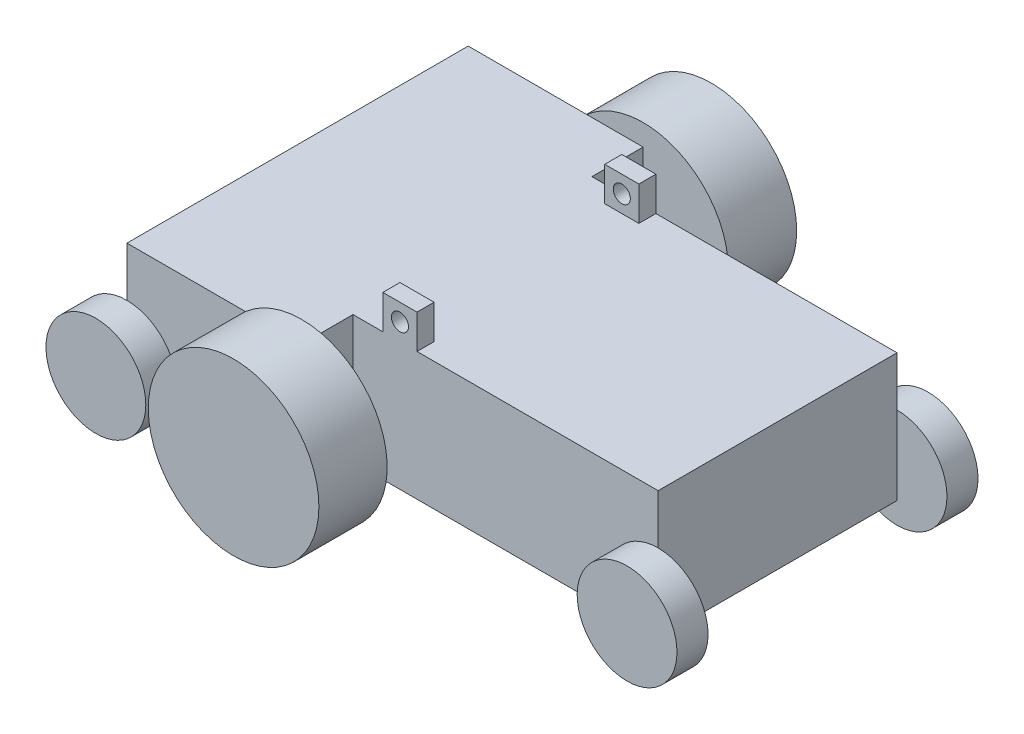
ISO-10303-21;
HEADER;
FILE_DESCRIPTION(('STEP AP214'),'2;1');
FILE_NAME('part.step','',(''),(''),'','','');
FILE_SCHEMA(('AUTOMOTIVE_DESIGN { 1 0 10303 214 1 1 1 1 }'));
ENDSEC;
DATA;
#1=APPLICATION_CONTEXT('core data for automotive mechanical design processes');
#2=APPLICATION_PROTOCOL_DEFINITION('international standard','automotive_design',2000,#1);
#3=PRODUCT_CONTEXT('',#1,'mechanical');
#4=PRODUCT('Part','Part','',(#3));
#5=PRODUCT_RELATED_PRODUCT_CATEGORY('part','',(#4));
#6=PRODUCT_DEFINITION_FORMATION('','',#4);
#7=PRODUCT_DEFINITION_CONTEXT('part definition',#1,'design');
#8=PRODUCT_DEFINITION('design','',#6,#7);
#9=PRODUCT_DEFINITION_SHAPE('','',#8);
#10=(LENGTH_UNIT() NAMED_UNIT(*) SI_UNIT(.MILLI.,.METRE.));
#11=(NAMED_UNIT(*) PLANE_ANGLE_UNIT() SI_UNIT($,.RADIAN.));
#12=(NAMED_UNIT(*) SI_UNIT($,.STERADIAN.) SOLID_ANGLE_UNIT());
#13=UNCERTAINTY_MEASURE_WITH_UNIT(LENGTH_MEASURE(1.E-05),#10,'distance_accuracy_value','');
#14=(GEOMETRIC_REPRESENTATION_CONTEXT(3) GLOBAL_UNCERTAINTY_ASSIGNED_CONTEXT((#13)) GLOBAL_UNIT_ASSIGNED_CONTEXT((#10,
#11,#12)) REPRESENTATION_CONTEXT('',''));
#15=CARTESIAN_POINT('',(0.,0.,0.));
#16=DIRECTION('',(0.,0.,1.));
#17=DIRECTION('',(1.,0.,0.));
#18=AXIS2_PLACEMENT_3D('',#15,#16,#17);
#19=CARTESIAN_POINT('',(0.,190.5,0.));
#20=DIRECTION('',(1.,0.,0.));
#21=DIRECTION('',(0.,0.,-1.));
#22=AXIS2_PLACEMENT_3D('',#19,#20,#21);
#23=PLANE('',#22);
#24=DIRECTION('',(0.,0.,1.));
#25=VECTOR('',#24,1.);
#26=CARTESIAN_POINT('',(0.,0.,0.));
#27=LINE('',#26,#25);
#28=CARTESIAN_POINT('',(0.,0.,-508.));
#29=VERTEX_POINT('',#28);
#30=CARTESIAN_POINT('',(0.,0.,0.));
#31=VERTEX_POINT('',#30);
#32=EDGE_CURVE('E317',#29,#31,#27,.T.);
#33=ORIENTED_EDGE('',*,*,#32,.T.);
#34=DIRECTION('',(0.,-1.,0.));
#35=VECTOR('',#34,1.);
#36=CARTESIAN_POINT('',(0.,190.5,0.));
#37=LINE('',#36,#35);
#38=CARTESIAN_POINT('',(0.,116.713,0.));
#39=VERTEX_POINT('',#38);
#40=EDGE_CURVE('E307',#39,#31,#37,.T.);
#41=ORIENTED_EDGE('',*,*,#40,.F.);
#42=DIRECTION('',(0.,-1.,0.));
#43=VECTOR('',#42,1.);
#44=CARTESIAN_POINT('',(0.,190.5,0.));
#45=LINE('',#44,#43);
#46=CARTESIAN_POINT('',(0.,190.5,0.));
#47=VERTEX_POINT('',#46);
#48=EDGE_CURVE('E13',#47,#39,#45,.T.);
#49=ORIENTED_EDGE('',*,*,#48,.F.);
#50=DIRECTION('',(0.,0.,1.));
#51=VECTOR('',#50,1.);
#52=CARTESIAN_POINT('',(0.,190.5,0.));
#53=LINE('',#52,#51);
#54=CARTESIAN_POINT('',(0.,190.5,-508.));
#55=VERTEX_POINT('',#54);
#56=EDGE_CURVE('E321',#55,#47,#53,.T.);
#57=ORIENTED_EDGE('',*,*,#56,.F.);
#58=DIRECTION('',(0.,-1.,0.));
#59=VECTOR('',#58,1.);
#60=CARTESIAN_POINT('',(0.,190.5,-508.));
#61=LINE('',#60,#59);
#62=CARTESIAN_POINT('',(0.,116.713,-508.));
#63=VERTEX_POINT('',#62);
#64=EDGE_CURVE('E346',#55,#63,#61,.T.);
#65=ORIENTED_EDGE('',*,*,#64,.T.);
#66=DIRECTION('',(0.,1.,0.));
#67=VECTOR('',#66,1.);
#68=CARTESIAN_POINT('',(0.,190.5,-508.));
#69=LINE('',#68,#67);
#70=EDGE_CURVE('E280',#29,#63,#69,.T.);
#71=ORIENTED_EDGE('',*,*,#70,.F.);
#72=EDGE_LOOP('',(#33,#41,#49,#57,#65,#71));
#73=FACE_BOUND('',#72,.T.);
#74=ADVANCED_FACE('F46',(#73),#23,.F.);
#75=CARTESIAN_POINT('',(0.,190.5,0.));
#76=DIRECTION('',(0.,0.,-1.));
#77=DIRECTION('',(-1.,0.,0.));
#78=AXIS2_PLACEMENT_3D('',#75,#76,#77);
#79=PLANE('',#78);
#80=CARTESIAN_POINT('',(0.,42.418,0.));
#81=DIRECTION('',(0.,0.,1.));
#82=DIRECTION('',(1.,0.,0.));
#83=AXIS2_PLACEMENT_3D('',#80,#81,#82);
#84=CIRCLE('',#83,74.295);
#85=CARTESIAN_POINT('',(60.9955760772861,0.,0.));
#86=VERTEX_POINT('',#85);
#87=EDGE_CURVE('E303',#86,#39,#84,.T.);
#88=ORIENTED_EDGE('',*,*,#87,.F.);
#89=DIRECTION('',(1.,0.,0.));
#90=VECTOR('',#89,1.);
#91=CARTESIAN_POINT('',(0.,0.,0.));
#92=LINE('',#91,#90);
#93=CARTESIAN_POINT('',(176.347395873699,0.,0.));
#94=VERTEX_POINT('',#93);
#95=EDGE_CURVE('E354',#86,#94,#92,.T.);
#96=ORIENTED_EDGE('',*,*,#95,.T.);
#97=CARTESIAN_POINT('',(260.35,95.25,0.));
#98=DIRECTION('',(0.,0.,1.));
#99=DIRECTION('',(1.,0.,0.));
#100=AXIS2_PLACEMENT_3D('',#97,#98,#99);
#101=CIRCLE('',#100,127.);
#102=CARTESIAN_POINT('',(176.347395873699,190.5,0.));
#103=VERTEX_POINT('',#102);
#104=EDGE_CURVE('E318',#103,#94,#101,.T.);
#105=ORIENTED_EDGE('',*,*,#104,.F.);
#106=DIRECTION('',(1.,0.,0.));
#107=VECTOR('',#106,1.);
#108=CARTESIAN_POINT('',(0.,190.5,0.));
#109=LINE('',#108,#107);
#110=EDGE_CURVE('E326',#47,#103,#109,.T.);
#111=ORIENTED_EDGE('',*,*,#110,.F.);
#112=ORIENTED_EDGE('',*,*,#48,.T.);
#113=EDGE_LOOP('',(#88,#96,#105,#111,#112));
#114=FACE_BOUND('',#113,.T.);
#115=ADVANCED_FACE('F406',(#114),#79,.F.);
#116=CARTESIAN_POINT('',(260.35,190.5,0.));
#117=DIRECTION('',(-1.,0.,0.));
#118=DIRECTION('',(0.,0.,1.));
#119=AXIS2_PLACEMENT_3D('',#116,#117,#118);
#120=PLANE('',#119);
#121=DIRECTION('',(0.,0.,-1.));
#122=VECTOR('',#121,1.);
#123=CARTESIAN_POINT('',(260.35,0.,0.));
#124=LINE('',#123,#122);
#125=CARTESIAN_POINT('',(260.35,0.,0.));
#126=VERTEX_POINT('',#125);
#127=CARTESIAN_POINT('',(260.35,0.,-76.2));
#128=VERTEX_POINT('',#127);
#129=EDGE_CURVE('E353',#126,#128,#124,.T.);
#130=ORIENTED_EDGE('',*,*,#129,.T.);
#131=DIRECTION('',(0.,-1.,0.));
#132=VECTOR('',#131,1.);
#133=CARTESIAN_POINT('',(260.35,190.5,-76.2));
#134=LINE('',#133,#132);
#135=CARTESIAN_POINT('',(260.35,190.5,-76.2));
#136=VERTEX_POINT('',#135);
#137=EDGE_CURVE('E386',#136,#128,#134,.T.);
#138=ORIENTED_EDGE('',*,*,#137,.F.);
#139=DIRECTION('',(0.,0.,-1.));
#140=VECTOR('',#139,1.);
#141=CARTESIAN_POINT('',(260.35,190.5,0.));
#142=LINE('',#141,#140);
#143=CARTESIAN_POINT('',(260.35,190.5,0.));
#144=VERTEX_POINT('',#143);
#145=EDGE_CURVE('E329',#144,#136,#142,.T.);
#146=ORIENTED_EDGE('',*,*,#145,.F.);
#147=DIRECTION('',(0.,-1.,0.));
#148=VECTOR('',#147,1.);
#149=CARTESIAN_POINT('',(260.35,190.5,0.));
#150=LINE('',#149,#148);
#151=EDGE_CURVE('E53',#144,#126,#150,.T.);
#152=ORIENTED_EDGE('',*,*,#151,.T.);
#153=EDGE_LOOP('',(#130,#138,#146,#152));
#154=FACE_BOUND('',#153,.T.);
#155=ADVANCED_FACE('F392',(#154),#120,.F.);
#156=CARTESIAN_POINT('',(260.35,190.5,-76.2));
#157=DIRECTION('',(0.,0.,-1.));
#158=DIRECTION('',(-1.,0.,0.));
#159=AXIS2_PLACEMENT_3D('',#156,#157,#158);
#160=PLANE('',#159);
#161=CARTESIAN_POINT('',(330.2,215.9,-76.2));
#162=DIRECTION('',(0.,0.,-1.));
#163=DIRECTION('',(-1.,0.,0.));
#164=AXIS2_PLACEMENT_3D('',#161,#162,#163);
#165=CIRCLE('',#164,12.7);
#166=CARTESIAN_POINT('',(317.5,215.9,-76.2));
#167=VERTEX_POINT('',#166);
#168=EDGE_CURVE('E233',#167,#167,#165,.T.);
#169=ORIENTED_EDGE('',*,*,#168,.T.);
#170=EDGE_LOOP('',(#169));
#171=FACE_BOUND('',#170,.T.);
#172=CARTESIAN_POINT('',(714.502,42.418,-76.2));
#173=DIRECTION('',(0.,0.,1.));
#174=DIRECTION('',(1.,0.,0.));
#175=AXIS2_PLACEMENT_3D('',#172,#173,#174);
#176=CIRCLE('',#175,74.295);
#177=CARTESIAN_POINT('',(714.502,116.713,-76.2));
#178=VERTEX_POINT('',#177);
#179=CARTESIAN_POINT('',(653.506423922714,0.,-76.2));
#180=VERTEX_POINT('',#179);
#181=EDGE_CURVE('E298',#178,#180,#176,.T.);
#182=ORIENTED_EDGE('',*,*,#181,.F.);
#183=DIRECTION('',(0.,-1.,0.));
#184=VECTOR('',#183,1.);
#185=CARTESIAN_POINT('',(714.502,190.5,-76.2));
#186=LINE('',#185,#184);
#187=CARTESIAN_POINT('',(714.502,190.5,-76.2));
#188=VERTEX_POINT('',#187);
#189=EDGE_CURVE('E383',#188,#178,#186,.T.);
#190=ORIENTED_EDGE('',*,*,#189,.F.);
#191=DIRECTION('',(1.,0.,0.));
#192=VECTOR('',#191,1.);
#193=CARTESIAN_POINT('',(260.35,190.5,-76.2));
#194=LINE('',#193,#192);
#195=CARTESIAN_POINT('',(355.6,190.5,-76.2));
#196=VERTEX_POINT('',#195);
#197=EDGE_CURVE('E331',#196,#188,#194,.T.);
#198=ORIENTED_EDGE('',*,*,#197,.F.);
#199=DIRECTION('',(0.,1.,0.));
#200=VECTOR('',#199,1.);
#201=CARTESIAN_POINT('',(355.6,190.5,-76.2));
#202=LINE('',#201,#200);
#203=CARTESIAN_POINT('',(355.6,241.3,-76.2));
#204=VERTEX_POINT('',#203);
#205=EDGE_CURVE('E253',#196,#204,#202,.T.);
#206=ORIENTED_EDGE('',*,*,#205,.T.);
#207=DIRECTION('',(-1.,0.,0.));
#208=VECTOR('',#207,1.);
#209=CARTESIAN_POINT('',(355.6,241.3,-76.2));
#210=LINE('',#209,#208);
#211=CARTESIAN_POINT('',(304.8,241.3,-76.2));
#212=VERTEX_POINT('',#211);
#213=EDGE_CURVE('E263',#204,#212,#210,.T.);
#214=ORIENTED_EDGE('',*,*,#213,.T.);
#215=DIRECTION('',(0.,1.,0.));
#216=VECTOR('',#215,1.);
#217=CARTESIAN_POINT('',(304.8,190.5,-76.2));
#218=LINE('',#217,#216);
#219=CARTESIAN_POINT('',(304.8,190.5,-76.2));
#220=VERTEX_POINT('',#219);
#221=EDGE_CURVE('E242',#220,#212,#218,.T.);
#222=ORIENTED_EDGE('',*,*,#221,.F.);
#223=EDGE_CURVE('E332',#136,#220,#194,.T.);
#224=ORIENTED_EDGE('',*,*,#223,.F.);
#225=ORIENTED_EDGE('',*,*,#137,.T.);
#226=DIRECTION('',(1.,0.,0.));
#227=VECTOR('',#226,1.);
#228=CARTESIAN_POINT('',(260.35,0.,-76.2));
#229=LINE('',#228,#227);
#230=EDGE_CURVE('E357',#128,#180,#229,.T.);
#231=ORIENTED_EDGE('',*,*,#230,.T.);
#232=EDGE_LOOP('',(#182,#190,#198,#206,#214,#222,#224,#225,#231));
#233=FACE_BOUND('',#232,.T.);
#234=ADVANCED_FACE('F439',(#171,#233),#160,.F.);
#235=CARTESIAN_POINT('',(714.502,190.5,-431.8));
#236=DIRECTION('',(-1.,0.,0.));
#237=DIRECTION('',(0.,0.,1.));
#238=AXIS2_PLACEMENT_3D('',#235,#236,#237);
#239=PLANE('',#238);
#240=DIRECTION('',(0.,0.,-1.));
#241=VECTOR('',#240,1.);
#242=CARTESIAN_POINT('',(714.502,0.,-431.8));
#243=LINE('',#242,#241);
#244=CARTESIAN_POINT('',(714.502,0.,-76.2));
#245=VERTEX_POINT('',#244);
#246=CARTESIAN_POINT('',(714.502,0.,-431.8));
#247=VERTEX_POINT('',#246);
#248=EDGE_CURVE('E360',#245,#247,#243,.T.);
#249=ORIENTED_EDGE('',*,*,#248,.T.);
#250=DIRECTION('',(0.,-1.,0.));
#251=VECTOR('',#250,1.);
#252=CARTESIAN_POINT('',(714.502,190.5,-431.8));
#253=LINE('',#252,#251);
#254=CARTESIAN_POINT('',(714.502,116.713,-431.8));
#255=VERTEX_POINT('',#254);
#256=EDGE_CURVE('E270',#255,#247,#253,.T.);
#257=ORIENTED_EDGE('',*,*,#256,.F.);
#258=DIRECTION('',(0.,-1.,0.));
#259=VECTOR('',#258,1.);
#260=CARTESIAN_POINT('',(714.502,190.5,-431.8));
#261=LINE('',#260,#259);
#262=CARTESIAN_POINT('',(714.502,190.5,-431.8));
#263=VERTEX_POINT('',#262);
#264=EDGE_CURVE('E380',#263,#255,#261,.T.);
#265=ORIENTED_EDGE('',*,*,#264,.F.);
#266=DIRECTION('',(0.,0.,-1.));
#267=VECTOR('',#266,1.);
#268=CARTESIAN_POINT('',(714.502,190.5,-431.8));
#269=LINE('',#268,#267);
#270=EDGE_CURVE('E334',#188,#263,#269,.T.);
#271=ORIENTED_EDGE('',*,*,#270,.F.);
#272=ORIENTED_EDGE('',*,*,#189,.T.);
#273=DIRECTION('',(0.,1.,0.));
#274=VECTOR('',#273,1.);
#275=CARTESIAN_POINT('',(714.502,190.5,-76.2));
#276=LINE('',#275,#274);
#277=EDGE_CURVE('E297',#245,#178,#276,.T.);
#278=ORIENTED_EDGE('',*,*,#277,.F.);
#279=EDGE_LOOP('',(#249,#257,#265,#271,#272,#278));
#280=FACE_BOUND('',#279,.T.);
#281=ADVANCED_FACE('F444',(#280),#239,.F.);
#282=CARTESIAN_POINT('',(260.35,190.5,-431.8));
#283=DIRECTION('',(0.,0.,1.));
#284=DIRECTION('',(1.,0.,0.));
#285=AXIS2_PLACEMENT_3D('',#282,#283,#284);
#286=PLANE('',#285);
#287=CARTESIAN_POINT('',(330.2,215.9,-431.8));
#288=DIRECTION('',(0.,0.,1.));
#289=DIRECTION('',(1.,0.,0.));
#290=AXIS2_PLACEMENT_3D('',#287,#288,#289);
#291=CIRCLE('',#290,12.7);
#292=CARTESIAN_POINT('',(342.9,215.9,-431.8));
#293=VERTEX_POINT('',#292);
#294=EDGE_CURVE('E211',#293,#293,#291,.F.);
#295=ORIENTED_EDGE('',*,*,#294,.F.);
#296=EDGE_LOOP('',(#295));
#297=FACE_BOUND('',#296,.T.);
#298=ORIENTED_EDGE('',*,*,#264,.T.);
#299=CARTESIAN_POINT('',(714.502,42.418,-431.8));
#300=DIRECTION('',(0.,0.,1.));
#301=DIRECTION('',(1.,0.,0.));
#302=AXIS2_PLACEMENT_3D('',#299,#300,#301);
#303=CIRCLE('',#302,74.295);
#304=CARTESIAN_POINT('',(653.506423922714,0.,-431.8));
#305=VERTEX_POINT('',#304);
#306=EDGE_CURVE('E271',#255,#305,#303,.T.);
#307=ORIENTED_EDGE('',*,*,#306,.T.);
#308=DIRECTION('',(-1.,0.,0.));
#309=VECTOR('',#308,1.);
#310=CARTESIAN_POINT('',(260.35,0.,-431.8));
#311=LINE('',#310,#309);
#312=CARTESIAN_POINT('',(260.35,0.,-431.8));
#313=VERTEX_POINT('',#312);
#314=EDGE_CURVE('E362',#305,#313,#311,.T.);
#315=ORIENTED_EDGE('',*,*,#314,.T.);
#316=DIRECTION('',(0.,-1.,0.));
#317=VECTOR('',#316,1.);
#318=CARTESIAN_POINT('',(260.35,190.5,-431.8));
#319=LINE('',#318,#317);
#320=CARTESIAN_POINT('',(260.35,190.5,-431.8));
#321=VERTEX_POINT('',#320);
#322=EDGE_CURVE('E377',#321,#313,#319,.T.);
#323=ORIENTED_EDGE('',*,*,#322,.F.);
#324=DIRECTION('',(-1.,0.,0.));
#325=VECTOR('',#324,1.);
#326=CARTESIAN_POINT('',(260.35,190.5,-431.8));
#327=LINE('',#326,#325);
#328=CARTESIAN_POINT('',(304.8,190.5,-431.8));
#329=VERTEX_POINT('',#328);
#330=EDGE_CURVE('E336',#329,#321,#327,.T.);
#331=ORIENTED_EDGE('',*,*,#330,.F.);
#332=DIRECTION('',(0.,1.,0.));
#333=VECTOR('',#332,1.);
#334=CARTESIAN_POINT('',(304.8,190.5,-431.8));
#335=LINE('',#334,#333);
#336=CARTESIAN_POINT('',(304.8,241.3,-431.8));
#337=VERTEX_POINT('',#336);
#338=EDGE_CURVE('E215',#329,#337,#335,.T.);
#339=ORIENTED_EDGE('',*,*,#338,.T.);
#340=DIRECTION('',(-1.,0.,0.));
#341=VECTOR('',#340,1.);
#342=CARTESIAN_POINT('',(355.6,241.3,-431.8));
#343=LINE('',#342,#341);
#344=CARTESIAN_POINT('',(355.6,241.3,-431.8));
#345=VERTEX_POINT('',#344);
#346=EDGE_CURVE('E203',#345,#337,#343,.T.);
#347=ORIENTED_EDGE('',*,*,#346,.F.);
#348=DIRECTION('',(0.,1.,0.));
#349=VECTOR('',#348,1.);
#350=CARTESIAN_POINT('',(355.6,190.5,-431.8));
#351=LINE('',#350,#349);
#352=CARTESIAN_POINT('',(355.6,190.5,-431.8));
#353=VERTEX_POINT('',#352);
#354=EDGE_CURVE('E224',#353,#345,#351,.T.);
#355=ORIENTED_EDGE('',*,*,#354,.F.);
#356=EDGE_CURVE('E337',#263,#353,#327,.T.);
#357=ORIENTED_EDGE('',*,*,#356,.F.);
#358=EDGE_LOOP('',(#298,#307,#315,#323,#331,#339,#347,#355,#357));
#359=FACE_BOUND('',#358,.T.);
#360=ADVANCED_FACE('F448',(#297,#359),#286,.F.);
#361=CARTESIAN_POINT('',(260.35,190.5,-508.));
#362=DIRECTION('',(-1.,0.,0.));
#363=DIRECTION('',(0.,0.,1.));
#364=AXIS2_PLACEMENT_3D('',#361,#362,#363);
#365=PLANE('',#364);
#366=DIRECTION('',(0.,0.,-1.));
#367=VECTOR('',#366,1.);
#368=CARTESIAN_POINT('',(260.35,0.,-508.));
#369=LINE('',#368,#367);
#370=CARTESIAN_POINT('',(260.35,0.,-508.));
#371=VERTEX_POINT('',#370);
#372=EDGE_CURVE('E366',#313,#371,#369,.T.);
#373=ORIENTED_EDGE('',*,*,#372,.T.);
#374=DIRECTION('',(0.,-1.,0.));
#375=VECTOR('',#374,1.);
#376=CARTESIAN_POINT('',(260.35,190.5,-508.));
#377=LINE('',#376,#375);
#378=CARTESIAN_POINT('',(260.35,190.5,-508.));
#379=VERTEX_POINT('',#378);
#380=EDGE_CURVE('E375',#379,#371,#377,.T.);
#381=ORIENTED_EDGE('',*,*,#380,.F.);
#382=DIRECTION('',(0.,0.,-1.));
#383=VECTOR('',#382,1.);
#384=CARTESIAN_POINT('',(260.35,190.5,-508.));
#385=LINE('',#384,#383);
#386=EDGE_CURVE('E339',#321,#379,#385,.T.);
#387=ORIENTED_EDGE('',*,*,#386,.F.);
#388=ORIENTED_EDGE('',*,*,#322,.T.);
#389=EDGE_LOOP('',(#373,#381,#387,#388));
#390=FACE_BOUND('',#389,.T.);
#391=ADVANCED_FACE('F452',(#390),#365,.F.);
#392=CARTESIAN_POINT('',(0.,190.5,-508.));
#393=DIRECTION('',(0.,0.,1.));
#394=DIRECTION('',(1.,0.,0.));
#395=AXIS2_PLACEMENT_3D('',#392,#393,#394);
#396=PLANE('',#395);
#397=DIRECTION('',(-1.,0.,0.));
#398=VECTOR('',#397,1.);
#399=CARTESIAN_POINT('',(0.,0.,-508.));
#400=LINE('',#399,#398);
#401=CARTESIAN_POINT('',(176.347395873699,0.,-508.));
#402=VERTEX_POINT('',#401);
#403=CARTESIAN_POINT('',(60.9955760772861,0.,-508.));
#404=VERTEX_POINT('',#403);
#405=EDGE_CURVE('E372',#402,#404,#400,.T.);
#406=ORIENTED_EDGE('',*,*,#405,.T.);
#407=CARTESIAN_POINT('',(0.,42.418,-508.));
#408=DIRECTION('',(0.,0.,1.));
#409=DIRECTION('',(1.,0.,0.));
#410=AXIS2_PLACEMENT_3D('',#407,#408,#409);
#411=CIRCLE('',#410,74.295);
#412=EDGE_CURVE('E276',#404,#63,#411,.T.);
#413=ORIENTED_EDGE('',*,*,#412,.T.);
#414=ORIENTED_EDGE('',*,*,#64,.F.);
#415=DIRECTION('',(-1.,0.,0.));
#416=VECTOR('',#415,1.);
#417=CARTESIAN_POINT('',(0.,190.5,-508.));
#418=LINE('',#417,#416);
#419=CARTESIAN_POINT('',(176.347395873699,190.5,-508.));
#420=VERTEX_POINT('',#419);
#421=EDGE_CURVE('E342',#420,#55,#418,.T.);
#422=ORIENTED_EDGE('',*,*,#421,.F.);
#423=CARTESIAN_POINT('',(260.35,95.25,-508.));
#424=DIRECTION('',(0.,0.,1.));
#425=DIRECTION('',(1.,0.,0.));
#426=AXIS2_PLACEMENT_3D('',#423,#424,#425);
#427=CIRCLE('',#426,127.);
#428=EDGE_CURVE('E291',#420,#402,#427,.T.);
#429=ORIENTED_EDGE('',*,*,#428,.T.);
#430=EDGE_LOOP('',(#406,#413,#414,#422,#429));
#431=FACE_BOUND('',#430,.T.);
#432=ADVANCED_FACE('F456',(#431),#396,.F.);
#433=CARTESIAN_POINT('',(0.,190.5,0.));
#434=DIRECTION('',(0.,-1.,0.));
#435=DIRECTION('',(0.,0.,-1.));
#436=AXIS2_PLACEMENT_3D('',#433,#434,#435);
#437=PLANE('',#436);
#438=ORIENTED_EDGE('',*,*,#356,.T.);
#439=DIRECTION('',(0.,0.,-1.));
#440=VECTOR('',#439,1.);
#441=CARTESIAN_POINT('',(355.6,190.5,-406.4));
#442=LINE('',#441,#440);
#443=CARTESIAN_POINT('',(355.6,190.5,-406.4));
#444=VERTEX_POINT('',#443);
#445=EDGE_CURVE('E60',#444,#353,#442,.T.);
#446=ORIENTED_EDGE('',*,*,#445,.F.);
#447=DIRECTION('',(-1.,0.,0.));
#448=VECTOR('',#447,1.);
#449=CARTESIAN_POINT('',(355.6,190.5,-406.4));
#450=LINE('',#449,#448);
#451=CARTESIAN_POINT('',(304.8,190.5,-406.4));
#452=VERTEX_POINT('',#451);
#453=EDGE_CURVE('E227',#444,#452,#450,.T.);
#454=ORIENTED_EDGE('',*,*,#453,.T.);
#455=DIRECTION('',(0.,0.,-1.));
#456=VECTOR('',#455,1.);
#457=CARTESIAN_POINT('',(304.8,190.5,-406.4));
#458=LINE('',#457,#456);
#459=EDGE_CURVE('E66',#452,#329,#458,.T.);
#460=ORIENTED_EDGE('',*,*,#459,.T.);
#461=ORIENTED_EDGE('',*,*,#330,.T.);
#462=ORIENTED_EDGE('',*,*,#386,.T.);
#463=EDGE_CURVE('E343',#379,#420,#418,.T.);
#464=ORIENTED_EDGE('',*,*,#463,.T.);
#465=ORIENTED_EDGE('',*,*,#421,.T.);
#466=ORIENTED_EDGE('',*,*,#56,.T.);
#467=ORIENTED_EDGE('',*,*,#110,.T.);
#468=EDGE_CURVE('E324',#103,#144,#109,.T.);
#469=ORIENTED_EDGE('',*,*,#468,.T.);
#470=ORIENTED_EDGE('',*,*,#145,.T.);
#471=ORIENTED_EDGE('',*,*,#223,.T.);
#472=DIRECTION('',(0.,0.,1.));
#473=VECTOR('',#472,1.);
#474=CARTESIAN_POINT('',(304.8,190.5,-101.6));
#475=LINE('',#474,#473);
#476=CARTESIAN_POINT('',(304.8,190.5,-101.6));
#477=VERTEX_POINT('',#476);
#478=EDGE_CURVE('E239',#477,#220,#475,.T.);
#479=ORIENTED_EDGE('',*,*,#478,.F.);
#480=DIRECTION('',(-1.,0.,0.));
#481=VECTOR('',#480,1.);
#482=CARTESIAN_POINT('',(355.6,190.5,-101.6));
#483=LINE('',#482,#481);
#484=CARTESIAN_POINT('',(355.6,190.5,-101.6));
#485=VERTEX_POINT('',#484);
#486=EDGE_CURVE('E259',#485,#477,#483,.T.);
#487=ORIENTED_EDGE('',*,*,#486,.F.);
#488=DIRECTION('',(0.,0.,1.));
#489=VECTOR('',#488,1.);
#490=CARTESIAN_POINT('',(355.6,190.5,-101.6));
#491=LINE('',#490,#489);
#492=EDGE_CURVE('E251',#485,#196,#491,.T.);
#493=ORIENTED_EDGE('',*,*,#492,.T.);
#494=ORIENTED_EDGE('',*,*,#197,.T.);
#495=ORIENTED_EDGE('',*,*,#270,.T.);
#496=EDGE_LOOP('',(#438,#446,#454,#460,#461,#462,#464,#465,#466,#467,#469,#470,#471,#479,#487,
#493,#494,#495));
#497=FACE_BOUND('',#496,.T.);
#498=ADVANCED_FACE('F460',(#497),#437,.F.);
#499=CARTESIAN_POINT('',(0.,0.,0.));
#500=DIRECTION('',(0.,-1.,0.));
#501=DIRECTION('',(0.,0.,-1.));
#502=AXIS2_PLACEMENT_3D('',#499,#500,#501);
#503=PLANE('',#502);
#504=ORIENTED_EDGE('',*,*,#32,.F.);
#505=EDGE_CURVE('E369',#404,#29,#400,.T.);
#506=ORIENTED_EDGE('',*,*,#505,.F.);
#507=ORIENTED_EDGE('',*,*,#405,.F.);
#508=EDGE_CURVE('E325',#371,#402,#400,.T.);
#509=ORIENTED_EDGE('',*,*,#508,.F.);
#510=ORIENTED_EDGE('',*,*,#372,.F.);
#511=ORIENTED_EDGE('',*,*,#314,.F.);
#512=EDGE_CURVE('E363',#247,#305,#311,.T.);
#513=ORIENTED_EDGE('',*,*,#512,.F.);
#514=ORIENTED_EDGE('',*,*,#248,.F.);
#515=EDGE_CURVE('E356',#180,#245,#229,.T.);
#516=ORIENTED_EDGE('',*,*,#515,.F.);
#517=ORIENTED_EDGE('',*,*,#230,.F.);
#518=ORIENTED_EDGE('',*,*,#129,.F.);
#519=EDGE_CURVE('E349',#94,#126,#92,.T.);
#520=ORIENTED_EDGE('',*,*,#519,.F.);
#521=ORIENTED_EDGE('',*,*,#95,.F.);
#522=EDGE_CURVE('E350',#31,#86,#92,.T.);
#523=ORIENTED_EDGE('',*,*,#522,.F.);
#524=EDGE_LOOP('',(#504,#506,#507,#509,#510,#511,#513,#514,#516,#517,#518,#520,#521,#523));
#525=FACE_BOUND('',#524,.T.);
#526=ADVANCED_FACE('F400',(#525),#503,.T.);
#527=CARTESIAN_POINT('',(260.35,95.25,0.));
#528=DIRECTION('',(0.,0.,1.));
#529=DIRECTION('',(1.,0.,0.));
#530=AXIS2_PLACEMENT_3D('',#527,#528,#529);
#531=PLANE('',#530);
#532=EDGE_CURVE('E313',#94,#103,#101,.T.);
#533=ORIENTED_EDGE('',*,*,#532,.F.);
#534=ORIENTED_EDGE('',*,*,#519,.T.);
#535=ORIENTED_EDGE('',*,*,#151,.F.);
#536=ORIENTED_EDGE('',*,*,#468,.F.);
#537=EDGE_LOOP('',(#533,#534,#535,#536));
#538=FACE_BOUND('',#537,.T.);
#539=ADVANCED_FACE('F402',(#538),#531,.F.);
#540=CARTESIAN_POINT('',(260.35,95.25,101.6));
#541=DIRECTION('',(0.,0.,-1.));
#542=DIRECTION('',(-1.,0.,0.));
#543=AXIS2_PLACEMENT_3D('',#540,#541,#542);
#544=CYLINDRICAL_SURFACE('',#543,127.);
#545=CARTESIAN_POINT('',(260.35,95.25,101.6));
#546=DIRECTION('',(0.,0.,1.));
#547=DIRECTION('',(1.,0.,0.));
#548=AXIS2_PLACEMENT_3D('',#545,#546,#547);
#549=CIRCLE('',#548,127.);
#550=CARTESIAN_POINT('',(387.35,95.25,101.6));
#551=VERTEX_POINT('',#550);
#552=EDGE_CURVE('E314',#551,#551,#549,.T.);
#553=ORIENTED_EDGE('',*,*,#552,.F.);
#554=EDGE_LOOP('',(#553));
#555=FACE_BOUND('',#554,.T.);
#556=ORIENTED_EDGE('',*,*,#104,.T.);
#557=ORIENTED_EDGE('',*,*,#532,.T.);
#558=EDGE_LOOP('',(#556,#557));
#559=FACE_BOUND('',#558,.T.);
#560=ADVANCED_FACE('F466',(#555,#559),#544,.T.);
#561=CARTESIAN_POINT('',(260.35,95.25,101.6));
#562=DIRECTION('',(0.,0.,1.));
#563=DIRECTION('',(1.,0.,0.));
#564=AXIS2_PLACEMENT_3D('',#561,#562,#563);
#565=PLANE('',#564);
#566=ORIENTED_EDGE('',*,*,#552,.T.);
#567=EDGE_LOOP('',(#566));
#568=FACE_BOUND('',#567,.T.);
#569=ADVANCED_FACE('F428',(#568),#565,.T.);
#570=CARTESIAN_POINT('',(0.,42.418,0.));
#571=DIRECTION('',(0.,0.,1.));
#572=DIRECTION('',(1.,0.,0.));
#573=AXIS2_PLACEMENT_3D('',#570,#571,#572);
#574=PLANE('',#573);
#575=EDGE_CURVE('E308',#39,#86,#84,.T.);
#576=ORIENTED_EDGE('',*,*,#575,.F.);
#577=ORIENTED_EDGE('',*,*,#40,.T.);
#578=ORIENTED_EDGE('',*,*,#522,.T.);
#579=EDGE_LOOP('',(#576,#577,#578));
#580=FACE_BOUND('',#579,.T.);
#581=ADVANCED_FACE('F414',(#580),#574,.F.);
#582=CARTESIAN_POINT('',(0.,42.418,46.228));
#583=DIRECTION('',(0.,0.,-1.));
#584=DIRECTION('',(-1.,0.,0.));
#585=AXIS2_PLACEMENT_3D('',#582,#583,#584);
#586=CYLINDRICAL_SURFACE('',#585,74.295);
#587=CARTESIAN_POINT('',(0.,42.418,46.228));
#588=DIRECTION('',(0.,0.,1.));
#589=DIRECTION('',(1.,0.,0.));
#590=AXIS2_PLACEMENT_3D('',#587,#588,#589);
#591=CIRCLE('',#590,74.295);
#592=CARTESIAN_POINT('',(74.295,42.418,46.228));
#593=VERTEX_POINT('',#592);
#594=EDGE_CURVE('E304',#593,#593,#591,.T.);
#595=ORIENTED_EDGE('',*,*,#594,.F.);
#596=EDGE_LOOP('',(#595));
#597=FACE_BOUND('',#596,.T.);
#598=ORIENTED_EDGE('',*,*,#575,.T.);
#599=ORIENTED_EDGE('',*,*,#87,.T.);
#600=EDGE_LOOP('',(#598,#599));
#601=FACE_BOUND('',#600,.T.);
#602=ADVANCED_FACE('F416',(#597,#601),#586,.T.);
#603=CARTESIAN_POINT('',(0.,42.418,46.228));
#604=DIRECTION('',(0.,0.,1.));
#605=DIRECTION('',(1.,0.,0.));
#606=AXIS2_PLACEMENT_3D('',#603,#604,#605);
#607=PLANE('',#606);
#608=ORIENTED_EDGE('',*,*,#594,.T.);
#609=EDGE_LOOP('',(#608));
#610=FACE_BOUND('',#609,.T.);
#611=ADVANCED_FACE('F418',(#610),#607,.T.);
#612=CARTESIAN_POINT('',(714.502,42.418,-76.2));
#613=DIRECTION('',(0.,0.,1.));
#614=DIRECTION('',(1.,0.,0.));
#615=AXIS2_PLACEMENT_3D('',#612,#613,#614);
#616=PLANE('',#615);
#617=ORIENTED_EDGE('',*,*,#515,.T.);
#618=ORIENTED_EDGE('',*,*,#277,.T.);
#619=EDGE_CURVE('E290',#180,#178,#176,.T.);
#620=ORIENTED_EDGE('',*,*,#619,.F.);
#621=EDGE_LOOP('',(#617,#618,#620));
#622=FACE_BOUND('',#621,.T.);
#623=ADVANCED_FACE('F425',(#622),#616,.F.);
#624=CARTESIAN_POINT('',(714.502,42.418,-29.972));
#625=DIRECTION('',(0.,0.,-1.));
#626=DIRECTION('',(-1.,0.,0.));
#627=AXIS2_PLACEMENT_3D('',#624,#625,#626);
#628=CYLINDRICAL_SURFACE('',#627,74.295);
#629=CARTESIAN_POINT('',(714.502,42.418,-29.972));
#630=DIRECTION('',(0.,0.,1.));
#631=DIRECTION('',(1.,0.,0.));
#632=AXIS2_PLACEMENT_3D('',#629,#630,#631);
#633=CIRCLE('',#632,74.295);
#634=CARTESIAN_POINT('',(788.797,42.418,-29.972));
#635=VERTEX_POINT('',#634);
#636=EDGE_CURVE('E294',#635,#635,#633,.T.);
#637=ORIENTED_EDGE('',*,*,#636,.F.);
#638=EDGE_LOOP('',(#637));
#639=FACE_BOUND('',#638,.T.);
#640=ORIENTED_EDGE('',*,*,#181,.T.);
#641=ORIENTED_EDGE('',*,*,#619,.T.);
#642=EDGE_LOOP('',(#640,#641));
#643=FACE_BOUND('',#642,.T.);
#644=ADVANCED_FACE('F504',(#639,#643),#628,.T.);
#645=CARTESIAN_POINT('',(714.502,42.418,-29.972));
#646=DIRECTION('',(0.,0.,1.));
#647=DIRECTION('',(1.,0.,0.));
#648=AXIS2_PLACEMENT_3D('',#645,#646,#647);
#649=PLANE('',#648);
#650=ORIENTED_EDGE('',*,*,#636,.T.);
#651=EDGE_LOOP('',(#650));
#652=FACE_BOUND('',#651,.T.);
#653=ADVANCED_FACE('F514',(#652),#649,.T.);
#654=CARTESIAN_POINT('',(260.35,95.25,-508.));
#655=DIRECTION('',(0.,0.,-1.));
#656=DIRECTION('',(1.,0.,0.));
#657=AXIS2_PLACEMENT_3D('',#654,#655,#656);
#658=PLANE('',#657);
#659=ORIENTED_EDGE('',*,*,#380,.T.);
#660=ORIENTED_EDGE('',*,*,#508,.T.);
#661=EDGE_CURVE('E286',#402,#420,#427,.T.);
#662=ORIENTED_EDGE('',*,*,#661,.T.);
#663=ORIENTED_EDGE('',*,*,#463,.F.);
#664=EDGE_LOOP('',(#659,#660,#662,#663));
#665=FACE_BOUND('',#664,.T.);
#666=ADVANCED_FACE('F523',(#665),#658,.F.);
#667=CARTESIAN_POINT('',(260.35,95.25,-609.6));
#668=DIRECTION('',(0.,0.,1.));
#669=DIRECTION('',(1.,0.,0.));
#670=AXIS2_PLACEMENT_3D('',#667,#668,#669);
#671=CYLINDRICAL_SURFACE('',#670,127.);
#672=CARTESIAN_POINT('',(260.35,95.25,-609.6));
#673=DIRECTION('',(0.,0.,1.));
#674=DIRECTION('',(1.,0.,0.));
#675=AXIS2_PLACEMENT_3D('',#672,#673,#674);
#676=CIRCLE('',#675,127.);
#677=CARTESIAN_POINT('',(387.35,95.25,-609.6));
#678=VERTEX_POINT('',#677);
#679=EDGE_CURVE('E287',#678,#678,#676,.T.);
#680=ORIENTED_EDGE('',*,*,#679,.T.);
#681=EDGE_LOOP('',(#680));
#682=FACE_BOUND('',#681,.T.);
#683=ORIENTED_EDGE('',*,*,#428,.F.);
#684=ORIENTED_EDGE('',*,*,#661,.F.);
#685=EDGE_LOOP('',(#683,#684));
#686=FACE_BOUND('',#685,.T.);
#687=ADVANCED_FACE('F566',(#682,#686),#671,.T.);
#688=CARTESIAN_POINT('',(260.35,95.25,-609.6));
#689=DIRECTION('',(0.,0.,-1.));
#690=DIRECTION('',(1.,0.,0.));
#691=AXIS2_PLACEMENT_3D('',#688,#689,#690);
#692=PLANE('',#691);
#693=ORIENTED_EDGE('',*,*,#679,.F.);
#694=EDGE_LOOP('',(#693));
#695=FACE_BOUND('',#694,.T.);
#696=ADVANCED_FACE('F576',(#695),#692,.T.);
#697=CARTESIAN_POINT('',(0.,42.418,-508.));
#698=DIRECTION('',(0.,0.,-1.));
#699=DIRECTION('',(1.,0.,0.));
#700=AXIS2_PLACEMENT_3D('',#697,#698,#699);
#701=PLANE('',#700);
#702=ORIENTED_EDGE('',*,*,#505,.T.);
#703=ORIENTED_EDGE('',*,*,#70,.T.);
#704=EDGE_CURVE('E281',#63,#404,#411,.T.);
#705=ORIENTED_EDGE('',*,*,#704,.T.);
#706=EDGE_LOOP('',(#702,#703,#705));
#707=FACE_BOUND('',#706,.T.);
#708=ADVANCED_FACE('F586',(#707),#701,.F.);
#709=CARTESIAN_POINT('',(0.,42.418,-554.228));
#710=DIRECTION('',(0.,0.,1.));
#711=DIRECTION('',(1.,0.,0.));
#712=AXIS2_PLACEMENT_3D('',#709,#710,#711);
#713=CYLINDRICAL_SURFACE('',#712,74.295);
#714=CARTESIAN_POINT('',(0.,42.418,-554.228));
#715=DIRECTION('',(0.,0.,1.));
#716=DIRECTION('',(1.,0.,0.));
#717=AXIS2_PLACEMENT_3D('',#714,#715,#716);
#718=CIRCLE('',#717,74.295);
#719=CARTESIAN_POINT('',(74.295,42.418,-554.228));
#720=VERTEX_POINT('',#719);
#721=EDGE_CURVE('E277',#720,#720,#718,.T.);
#722=ORIENTED_EDGE('',*,*,#721,.T.);
#723=EDGE_LOOP('',(#722));
#724=FACE_BOUND('',#723,.T.);
#725=ORIENTED_EDGE('',*,*,#704,.F.);
#726=ORIENTED_EDGE('',*,*,#412,.F.);
#727=EDGE_LOOP('',(#725,#726));
#728=FACE_BOUND('',#727,.T.);
#729=ADVANCED_FACE('F596',(#724,#728),#713,.T.);
#730=CARTESIAN_POINT('',(0.,42.418,-554.228));
#731=DIRECTION('',(0.,0.,-1.));
#732=DIRECTION('',(1.,0.,0.));
#733=AXIS2_PLACEMENT_3D('',#730,#731,#732);
#734=PLANE('',#733);
#735=ORIENTED_EDGE('',*,*,#721,.F.);
#736=EDGE_LOOP('',(#735));
#737=FACE_BOUND('',#736,.T.);
#738=ADVANCED_FACE('F606',(#737),#734,.T.);
#739=CARTESIAN_POINT('',(714.502,42.418,-431.8));
#740=DIRECTION('',(0.,0.,-1.));
#741=DIRECTION('',(1.,0.,0.));
#742=AXIS2_PLACEMENT_3D('',#739,#740,#741);
#743=PLANE('',#742);
#744=EDGE_CURVE('E262',#305,#255,#303,.T.);
#745=ORIENTED_EDGE('',*,*,#744,.T.);
#746=ORIENTED_EDGE('',*,*,#256,.T.);
#747=ORIENTED_EDGE('',*,*,#512,.T.);
#748=EDGE_LOOP('',(#745,#746,#747));
#749=FACE_BOUND('',#748,.T.);
#750=ADVANCED_FACE('F616',(#749),#743,.F.);
#751=CARTESIAN_POINT('',(714.502,42.418,-478.028));
#752=DIRECTION('',(0.,0.,1.));
#753=DIRECTION('',(1.,0.,0.));
#754=AXIS2_PLACEMENT_3D('',#751,#752,#753);
#755=CYLINDRICAL_SURFACE('',#754,74.295);
#756=CARTESIAN_POINT('',(714.502,42.418,-478.028));
#757=DIRECTION('',(0.,0.,1.));
#758=DIRECTION('',(1.,0.,0.));
#759=AXIS2_PLACEMENT_3D('',#756,#757,#758);
#760=CIRCLE('',#759,74.295);
#761=CARTESIAN_POINT('',(788.797,42.418,-478.028));
#762=VERTEX_POINT('',#761);
#763=EDGE_CURVE('E267',#762,#762,#760,.T.);
#764=ORIENTED_EDGE('',*,*,#763,.T.);
#765=EDGE_LOOP('',(#764));
#766=FACE_BOUND('',#765,.T.);
#767=ORIENTED_EDGE('',*,*,#306,.F.);
#768=ORIENTED_EDGE('',*,*,#744,.F.);
#769=EDGE_LOOP('',(#767,#768));
#770=FACE_BOUND('',#769,.T.);
#771=ADVANCED_FACE('F626',(#766,#770),#755,.T.);
#772=CARTESIAN_POINT('',(714.502,42.418,-478.028));
#773=DIRECTION('',(0.,0.,-1.));
#774=DIRECTION('',(1.,0.,0.));
#775=AXIS2_PLACEMENT_3D('',#772,#773,#774);
#776=PLANE('',#775);
#777=ORIENTED_EDGE('',*,*,#763,.F.);
#778=EDGE_LOOP('',(#777));
#779=FACE_BOUND('',#778,.T.);
#780=ADVANCED_FACE('F636',(#779),#776,.T.);
#781=CARTESIAN_POINT('',(355.6,190.5,-101.6));
#782=DIRECTION('',(0.,0.,-1.));
#783=DIRECTION('',(-1.,0.,0.));
#784=AXIS2_PLACEMENT_3D('',#781,#782,#783);
#785=PLANE('',#784);
#786=CARTESIAN_POINT('',(330.2,215.9,-101.6));
#787=DIRECTION('',(0.,0.,-1.));
#788=DIRECTION('',(-1.,0.,0.));
#789=AXIS2_PLACEMENT_3D('',#786,#787,#788);
#790=CIRCLE('',#789,12.7);
#791=CARTESIAN_POINT('',(317.5,215.9,-101.6));
#792=VERTEX_POINT('',#791);
#793=EDGE_CURVE('E229',#792,#792,#790,.T.);
#794=ORIENTED_EDGE('',*,*,#793,.F.);
#795=EDGE_LOOP('',(#794));
#796=FACE_BOUND('',#795,.T.);
#797=ORIENTED_EDGE('',*,*,#486,.T.);
#798=DIRECTION('',(0.,-1.,0.));
#799=VECTOR('',#798,1.);
#800=CARTESIAN_POINT('',(304.8,190.5,-101.6));
#801=LINE('',#800,#799);
#802=CARTESIAN_POINT('',(304.8,241.3,-101.6));
#803=VERTEX_POINT('',#802);
#804=EDGE_CURVE('E236',#803,#477,#801,.T.);
#805=ORIENTED_EDGE('',*,*,#804,.F.);
#806=DIRECTION('',(-1.,0.,0.));
#807=VECTOR('',#806,1.);
#808=CARTESIAN_POINT('',(355.6,241.3,-101.6));
#809=LINE('',#808,#807);
#810=CARTESIAN_POINT('',(355.6,241.3,-101.6));
#811=VERTEX_POINT('',#810);
#812=EDGE_CURVE('E260',#811,#803,#809,.T.);
#813=ORIENTED_EDGE('',*,*,#812,.F.);
#814=DIRECTION('',(0.,-1.,0.));
#815=VECTOR('',#814,1.);
#816=CARTESIAN_POINT('',(355.6,190.5,-101.6));
#817=LINE('',#816,#815);
#818=EDGE_CURVE('E248',#811,#485,#817,.T.);
#819=ORIENTED_EDGE('',*,*,#818,.T.);
#820=EDGE_LOOP('',(#797,#805,#813,#819));
#821=FACE_BOUND('',#820,.T.);
#822=ADVANCED_FACE('F646',(#796,#821),#785,.T.);
#823=CARTESIAN_POINT('',(355.6,241.3,-101.6));
#824=DIRECTION('',(0.,1.,0.));
#825=DIRECTION('',(0.,0.,1.));
#826=AXIS2_PLACEMENT_3D('',#823,#824,#825);
#827=PLANE('',#826);
#828=ORIENTED_EDGE('',*,*,#812,.T.);
#829=DIRECTION('',(0.,0.,-1.));
#830=VECTOR('',#829,1.);
#831=CARTESIAN_POINT('',(304.8,241.3,-101.6));
#832=LINE('',#831,#830);
#833=EDGE_CURVE('E245',#212,#803,#832,.T.);
#834=ORIENTED_EDGE('',*,*,#833,.F.);
#835=ORIENTED_EDGE('',*,*,#213,.F.);
#836=DIRECTION('',(0.,0.,-1.));
#837=VECTOR('',#836,1.);
#838=CARTESIAN_POINT('',(355.6,241.3,-101.6));
#839=LINE('',#838,#837);
#840=EDGE_CURVE('E256',#204,#811,#839,.T.);
#841=ORIENTED_EDGE('',*,*,#840,.T.);
#842=EDGE_LOOP('',(#828,#834,#835,#841));
#843=FACE_BOUND('',#842,.T.);
#844=ADVANCED_FACE('F654',(#843),#827,.T.);
#845=CARTESIAN_POINT('',(355.6,0.,0.));
#846=DIRECTION('',(1.,0.,0.));
#847=DIRECTION('',(0.,0.,-1.));
#848=AXIS2_PLACEMENT_3D('',#845,#846,#847);
#849=PLANE('',#848);
#850=ORIENTED_EDGE('',*,*,#818,.F.);
#851=ORIENTED_EDGE('',*,*,#840,.F.);
#852=ORIENTED_EDGE('',*,*,#205,.F.);
#853=ORIENTED_EDGE('',*,*,#492,.F.);
#854=EDGE_LOOP('',(#850,#851,#852,#853));
#855=FACE_BOUND('',#854,.T.);
#856=ADVANCED_FACE('F659',(#855),#849,.T.);
#857=CARTESIAN_POINT('',(304.8,0.,0.));
#858=DIRECTION('',(1.,0.,0.));
#859=DIRECTION('',(0.,0.,-1.));
#860=AXIS2_PLACEMENT_3D('',#857,#858,#859);
#861=PLANE('',#860);
#862=ORIENTED_EDGE('',*,*,#804,.T.);
#863=ORIENTED_EDGE('',*,*,#478,.T.);
#864=ORIENTED_EDGE('',*,*,#221,.T.);
#865=ORIENTED_EDGE('',*,*,#833,.T.);
#866=EDGE_LOOP('',(#862,#863,#864,#865));
#867=FACE_BOUND('',#866,.T.);
#868=ADVANCED_FACE('F670',(#867),#861,.F.);
#869=CARTESIAN_POINT('',(330.2,215.9,-28.448));
#870=DIRECTION('',(0.,0.,-1.));
#871=DIRECTION('',(-1.,0.,0.));
#872=AXIS2_PLACEMENT_3D('',#869,#870,#871);
#873=CYLINDRICAL_SURFACE('',#872,12.7);
#874=ORIENTED_EDGE('',*,*,#793,.T.);
#875=EDGE_LOOP('',(#874));
#876=FACE_BOUND('',#875,.T.);
#877=ORIENTED_EDGE('',*,*,#168,.F.);
#878=EDGE_LOOP('',(#877));
#879=FACE_BOUND('',#878,.T.);
#880=ADVANCED_FACE('F680',(#876,#879),#873,.F.);
#881=CARTESIAN_POINT('',(355.6,190.5,-406.4));
#882=DIRECTION('',(0.,0.,-1.));
#883=DIRECTION('',(-1.,0.,0.));
#884=AXIS2_PLACEMENT_3D('',#881,#882,#883);
#885=PLANE('',#884);
#886=CARTESIAN_POINT('',(330.2,215.9,-406.4));
#887=DIRECTION('',(0.,0.,-1.));
#888=DIRECTION('',(-1.,0.,0.));
#889=AXIS2_PLACEMENT_3D('',#886,#887,#888);
#890=CIRCLE('',#889,12.7);
#891=CARTESIAN_POINT('',(317.5,215.9,-406.4));
#892=VERTEX_POINT('',#891);
#893=EDGE_CURVE('E765',#892,#892,#890,.T.);
#894=ORIENTED_EDGE('',*,*,#893,.T.);
#895=EDGE_LOOP('',(#894));
#896=FACE_BOUND('',#895,.T.);
#897=DIRECTION('',(-1.,0.,0.));
#898=VECTOR('',#897,1.);
#899=CARTESIAN_POINT('',(355.6,241.3,-406.4));
#900=LINE('',#899,#898);
#901=CARTESIAN_POINT('',(355.6,241.3,-406.4));
#902=VERTEX_POINT('',#901);
#903=CARTESIAN_POINT('',(304.8,241.3,-406.4));
#904=VERTEX_POINT('',#903);
#905=EDGE_CURVE('E194',#902,#904,#900,.T.);
#906=ORIENTED_EDGE('',*,*,#905,.T.);
#907=DIRECTION('',(0.,-1.,0.));
#908=VECTOR('',#907,1.);
#909=CARTESIAN_POINT('',(304.8,190.5,-406.4));
#910=LINE('',#909,#908);
#911=EDGE_CURVE('E198',#904,#452,#910,.T.);
#912=ORIENTED_EDGE('',*,*,#911,.T.);
#913=ORIENTED_EDGE('',*,*,#453,.F.);
#914=DIRECTION('',(0.,-1.,0.));
#915=VECTOR('',#914,1.);
#916=CARTESIAN_POINT('',(355.6,190.5,-406.4));
#917=LINE('',#916,#915);
#918=EDGE_CURVE('E199',#902,#444,#917,.T.);
#919=ORIENTED_EDGE('',*,*,#918,.F.);
#920=EDGE_LOOP('',(#906,#912,#913,#919));
#921=FACE_BOUND('',#920,.T.);
#922=ADVANCED_FACE('F196',(#896,#921),#885,.F.);
#923=CARTESIAN_POINT('',(355.6,241.3,-406.4));
#924=DIRECTION('',(0.,-1.,0.));
#925=DIRECTION('',(0.,0.,-1.));
#926=AXIS2_PLACEMENT_3D('',#923,#924,#925);
#927=PLANE('',#926);
#928=ORIENTED_EDGE('',*,*,#346,.T.);
#929=DIRECTION('',(0.,0.,1.));
#930=VECTOR('',#929,1.);
#931=CARTESIAN_POINT('',(304.8,241.3,-406.4));
#932=LINE('',#931,#930);
#933=EDGE_CURVE('E209',#337,#904,#932,.T.);
#934=ORIENTED_EDGE('',*,*,#933,.T.);
#935=ORIENTED_EDGE('',*,*,#905,.F.);
#936=DIRECTION('',(0.,0.,1.));
#937=VECTOR('',#936,1.);
#938=CARTESIAN_POINT('',(355.6,241.3,-406.4));
#939=LINE('',#938,#937);
#940=EDGE_CURVE('E222',#345,#902,#939,.T.);
#941=ORIENTED_EDGE('',*,*,#940,.F.);
#942=EDGE_LOOP('',(#928,#934,#935,#941));
#943=FACE_BOUND('',#942,.T.);
#944=ADVANCED_FACE('F213',(#943),#927,.F.);
#945=CARTESIAN_POINT('',(355.6,0.,-508.));
#946=DIRECTION('',(1.,0.,0.));
#947=DIRECTION('',(0.,0.,1.));
#948=AXIS2_PLACEMENT_3D('',#945,#946,#947);
#949=PLANE('',#948);
#950=ORIENTED_EDGE('',*,*,#918,.T.);
#951=ORIENTED_EDGE('',*,*,#445,.T.);
#952=ORIENTED_EDGE('',*,*,#354,.T.);
#953=ORIENTED_EDGE('',*,*,#940,.T.);
#954=EDGE_LOOP('',(#950,#951,#952,#953));
#955=FACE_BOUND('',#954,.T.);
#956=ADVANCED_FACE('F731',(#955),#949,.T.);
#957=CARTESIAN_POINT('',(304.8,0.,-508.));
#958=DIRECTION('',(1.,0.,0.));
#959=DIRECTION('',(0.,0.,1.));
#960=AXIS2_PLACEMENT_3D('',#957,#958,#959);
#961=PLANE('',#960);
#962=ORIENTED_EDGE('',*,*,#911,.F.);
#963=ORIENTED_EDGE('',*,*,#933,.F.);
#964=ORIENTED_EDGE('',*,*,#338,.F.);
#965=ORIENTED_EDGE('',*,*,#459,.F.);
#966=EDGE_LOOP('',(#962,#963,#964,#965));
#967=FACE_BOUND('',#966,.T.);
#968=ADVANCED_FACE('F207',(#967),#961,.F.);
#969=CARTESIAN_POINT('',(330.2,215.9,-479.552));
#970=DIRECTION('',(0.,0.,1.));
#971=DIRECTION('',(1.,0.,0.));
#972=AXIS2_PLACEMENT_3D('',#969,#970,#971);
#973=CYLINDRICAL_SURFACE('',#972,12.7);
#974=ORIENTED_EDGE('',*,*,#893,.F.);
#975=EDGE_LOOP('',(#974));
#976=FACE_BOUND('',#975,.T.);
#977=ORIENTED_EDGE('',*,*,#294,.T.);
#978=EDGE_LOOP('',(#977));
#979=FACE_BOUND('',#978,.T.);
#980=ADVANCED_FACE('F749',(#976,#979),#973,.F.);
#981=CLOSED_SHELL('',(#74,#115,#155,#234,#281,#360,#391,#432,#498,#526,#539,#560,#569,#581,#602,
#611,#623,#644,#653,#666,#687,#696,#708,#729,#738,#750,#771,#780,#822,#844,#856,#868,#880,#922,
#944,#956,#968,#980));
#982=MANIFOLD_SOLID_BREP('B2',#981);
#983=ADVANCED_BREP_SHAPE_REPRESENTATION('',(#18,#982),#14);
#984=SHAPE_DEFINITION_REPRESENTATION(#9,#983);
ENDSEC;
END-ISO-10303-21;
